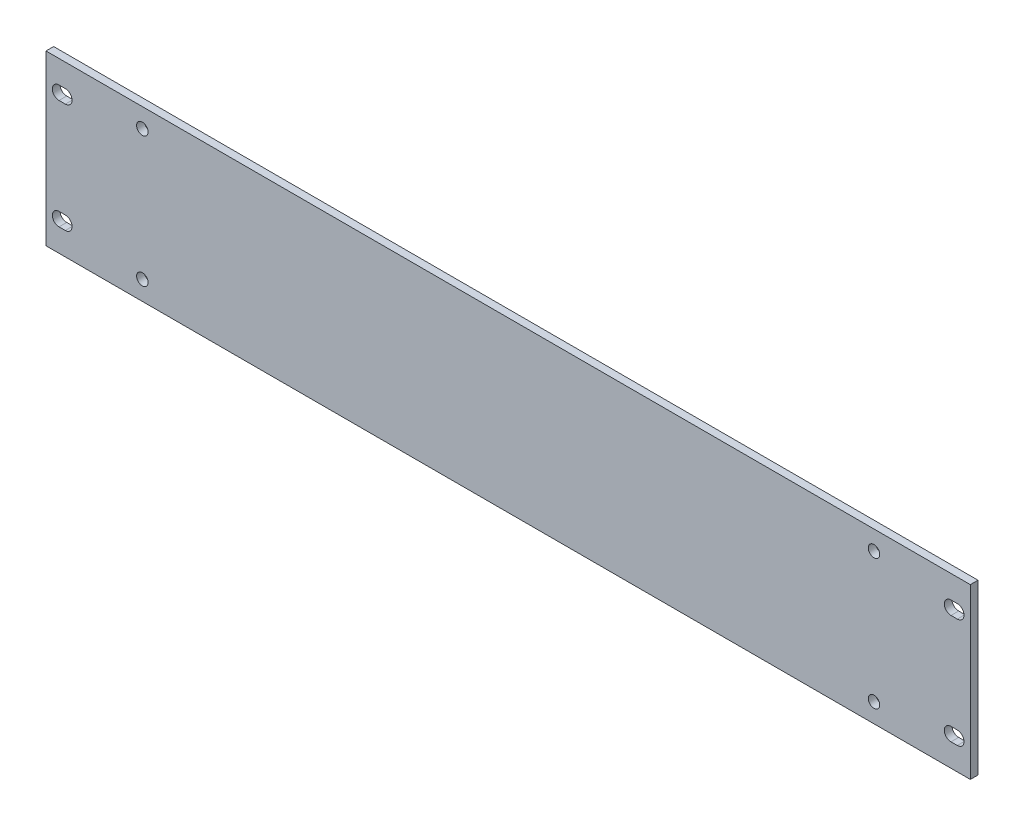
ISO-10303-21;
HEADER;
FILE_DESCRIPTION(('STEP AP214'),'2;1');
FILE_NAME('part.step','',(''),(''),'','','');
FILE_SCHEMA(('AUTOMOTIVE_DESIGN { 1 0 10303 214 1 1 1 1 }'));
ENDSEC;
DATA;
#1=APPLICATION_CONTEXT('core data for automotive mechanical design processes');
#2=APPLICATION_PROTOCOL_DEFINITION('international standard','automotive_design',2000,#1);
#3=PRODUCT_CONTEXT('',#1,'mechanical');
#4=PRODUCT('Part','Part','',(#3));
#5=PRODUCT_RELATED_PRODUCT_CATEGORY('part','',(#4));
#6=PRODUCT_DEFINITION_FORMATION('','',#4);
#7=PRODUCT_DEFINITION_CONTEXT('part definition',#1,'design');
#8=PRODUCT_DEFINITION('design','',#6,#7);
#9=PRODUCT_DEFINITION_SHAPE('','',#8);
#10=(LENGTH_UNIT() NAMED_UNIT(*) SI_UNIT(.MILLI.,.METRE.));
#11=(NAMED_UNIT(*) PLANE_ANGLE_UNIT() SI_UNIT($,.RADIAN.));
#12=(NAMED_UNIT(*) SI_UNIT($,.STERADIAN.) SOLID_ANGLE_UNIT());
#13=UNCERTAINTY_MEASURE_WITH_UNIT(LENGTH_MEASURE(1.E-05),#10,'distance_accuracy_value','');
#14=(GEOMETRIC_REPRESENTATION_CONTEXT(3) GLOBAL_UNCERTAINTY_ASSIGNED_CONTEXT((#13)) GLOBAL_UNIT_ASSIGNED_CONTEXT((#10,
#11,#12)) REPRESENTATION_CONTEXT('',''));
#15=CARTESIAN_POINT('',(0.,0.,0.));
#16=DIRECTION('',(0.,0.,1.));
#17=DIRECTION('',(1.,0.,0.));
#18=AXIS2_PLACEMENT_3D('',#15,#16,#17);
#19=CARTESIAN_POINT('',(0.,0.,4.));
#20=DIRECTION('',(1.,0.,0.));
#21=DIRECTION('',(0.,0.,-1.));
#22=AXIS2_PLACEMENT_3D('',#19,#20,#21);
#23=PLANE('',#22);
#24=DIRECTION('',(0.,-1.,0.));
#25=VECTOR('',#24,1.);
#26=CARTESIAN_POINT('',(0.,0.,0.));
#27=LINE('',#26,#25);
#28=CARTESIAN_POINT('',(0.,88.1,0.));
#29=VERTEX_POINT('',#28);
#30=CARTESIAN_POINT('',(0.,0.,0.));
#31=VERTEX_POINT('',#30);
#32=EDGE_CURVE('E299',#29,#31,#27,.T.);
#33=ORIENTED_EDGE('',*,*,#32,.T.);
#34=DIRECTION('',(0.,0.,-1.));
#35=VECTOR('',#34,1.);
#36=CARTESIAN_POINT('',(0.,0.,4.));
#37=LINE('',#36,#35);
#38=CARTESIAN_POINT('',(0.,0.,4.));
#39=VERTEX_POINT('',#38);
#40=EDGE_CURVE('E11',#39,#31,#37,.T.);
#41=ORIENTED_EDGE('',*,*,#40,.F.);
#42=DIRECTION('',(0.,-1.,0.));
#43=VECTOR('',#42,1.);
#44=CARTESIAN_POINT('',(0.,0.,4.));
#45=LINE('',#44,#43);
#46=CARTESIAN_POINT('',(0.,88.1,4.));
#47=VERTEX_POINT('',#46);
#48=EDGE_CURVE('E306',#47,#39,#45,.T.);
#49=ORIENTED_EDGE('',*,*,#48,.F.);
#50=DIRECTION('',(0.,0.,-1.));
#51=VECTOR('',#50,1.);
#52=CARTESIAN_POINT('',(0.,88.1,4.));
#53=LINE('',#52,#51);
#54=EDGE_CURVE('E316',#47,#29,#53,.T.);
#55=ORIENTED_EDGE('',*,*,#54,.T.);
#56=EDGE_LOOP('',(#33,#41,#49,#55));
#57=FACE_BOUND('',#56,.T.);
#58=ADVANCED_FACE('F33',(#57),#23,.F.);
#59=CARTESIAN_POINT('',(0.,0.,4.));
#60=DIRECTION('',(0.,1.,0.));
#61=DIRECTION('',(0.,0.,1.));
#62=AXIS2_PLACEMENT_3D('',#59,#60,#61);
#63=PLANE('',#62);
#64=DIRECTION('',(1.,0.,0.));
#65=VECTOR('',#64,1.);
#66=CARTESIAN_POINT('',(0.,0.,0.));
#67=LINE('',#66,#65);
#68=CARTESIAN_POINT('',(482.6,0.,0.));
#69=VERTEX_POINT('',#68);
#70=EDGE_CURVE('E319',#31,#69,#67,.T.);
#71=ORIENTED_EDGE('',*,*,#70,.T.);
#72=DIRECTION('',(0.,0.,-1.));
#73=VECTOR('',#72,1.);
#74=CARTESIAN_POINT('',(482.6,0.,4.));
#75=LINE('',#74,#73);
#76=CARTESIAN_POINT('',(482.6,0.,4.));
#77=VERTEX_POINT('',#76);
#78=EDGE_CURVE('E40',#77,#69,#75,.T.);
#79=ORIENTED_EDGE('',*,*,#78,.F.);
#80=DIRECTION('',(1.,0.,0.));
#81=VECTOR('',#80,1.);
#82=CARTESIAN_POINT('',(0.,0.,4.));
#83=LINE('',#82,#81);
#84=EDGE_CURVE('E309',#39,#77,#83,.T.);
#85=ORIENTED_EDGE('',*,*,#84,.F.);
#86=ORIENTED_EDGE('',*,*,#40,.T.);
#87=EDGE_LOOP('',(#71,#79,#85,#86));
#88=FACE_BOUND('',#87,.T.);
#89=ADVANCED_FACE('F348',(#88),#63,.F.);
#90=CARTESIAN_POINT('',(482.6,0.,4.));
#91=DIRECTION('',(-1.,0.,0.));
#92=DIRECTION('',(0.,0.,1.));
#93=AXIS2_PLACEMENT_3D('',#90,#91,#92);
#94=PLANE('',#93);
#95=DIRECTION('',(0.,1.,0.));
#96=VECTOR('',#95,1.);
#97=CARTESIAN_POINT('',(482.6,0.,0.));
#98=LINE('',#97,#96);
#99=CARTESIAN_POINT('',(482.6,88.1,0.));
#100=VERTEX_POINT('',#99);
#101=EDGE_CURVE('E321',#69,#100,#98,.T.);
#102=ORIENTED_EDGE('',*,*,#101,.T.);
#103=DIRECTION('',(0.,0.,-1.));
#104=VECTOR('',#103,1.);
#105=CARTESIAN_POINT('',(482.6,88.1,4.));
#106=LINE('',#105,#104);
#107=CARTESIAN_POINT('',(482.6,88.1,4.));
#108=VERTEX_POINT('',#107);
#109=EDGE_CURVE('E326',#108,#100,#106,.T.);
#110=ORIENTED_EDGE('',*,*,#109,.F.);
#111=DIRECTION('',(0.,1.,0.));
#112=VECTOR('',#111,1.);
#113=CARTESIAN_POINT('',(482.6,0.,4.));
#114=LINE('',#113,#112);
#115=EDGE_CURVE('E312',#77,#108,#114,.T.);
#116=ORIENTED_EDGE('',*,*,#115,.F.);
#117=ORIENTED_EDGE('',*,*,#78,.T.);
#118=EDGE_LOOP('',(#102,#110,#116,#117));
#119=FACE_BOUND('',#118,.T.);
#120=ADVANCED_FACE('F333',(#119),#94,.F.);
#121=CARTESIAN_POINT('',(0.,88.1,4.));
#122=DIRECTION('',(0.,-1.,0.));
#123=DIRECTION('',(0.,0.,-1.));
#124=AXIS2_PLACEMENT_3D('',#121,#122,#123);
#125=PLANE('',#124);
#126=DIRECTION('',(-1.,0.,0.));
#127=VECTOR('',#126,1.);
#128=CARTESIAN_POINT('',(0.,88.1,0.));
#129=LINE('',#128,#127);
#130=EDGE_CURVE('E310',#100,#29,#129,.T.);
#131=ORIENTED_EDGE('',*,*,#130,.T.);
#132=ORIENTED_EDGE('',*,*,#54,.F.);
#133=DIRECTION('',(-1.,0.,0.));
#134=VECTOR('',#133,1.);
#135=CARTESIAN_POINT('',(0.,88.1,4.));
#136=LINE('',#135,#134);
#137=EDGE_CURVE('E314',#108,#47,#136,.T.);
#138=ORIENTED_EDGE('',*,*,#137,.F.);
#139=ORIENTED_EDGE('',*,*,#109,.T.);
#140=EDGE_LOOP('',(#131,#132,#138,#139));
#141=FACE_BOUND('',#140,.T.);
#142=ADVANCED_FACE('F341',(#141),#125,.F.);
#143=CARTESIAN_POINT('',(0.,0.,4.));
#144=DIRECTION('',(0.,0.,-1.));
#145=DIRECTION('',(-1.,0.,0.));
#146=AXIS2_PLACEMENT_3D('',#143,#144,#145);
#147=PLANE('',#146);
#148=CARTESIAN_POINT('',(50.3000000000007,10.,4.));
#149=DIRECTION('',(0.,0.,1.));
#150=DIRECTION('',(1.,0.,0.));
#151=AXIS2_PLACEMENT_3D('',#148,#149,#150);
#152=CIRCLE('',#151,3.00000000000001);
#153=CARTESIAN_POINT('',(53.3000000000007,10.,4.));
#154=VERTEX_POINT('',#153);
#155=EDGE_CURVE('E446',#154,#154,#152,.T.);
#156=ORIENTED_EDGE('',*,*,#155,.F.);
#157=EDGE_LOOP('',(#156));
#158=FACE_BOUND('',#157,.T.);
#159=CARTESIAN_POINT('',(432.300000000001,9.99999999999999,4.));
#160=DIRECTION('',(0.,0.,1.));
#161=DIRECTION('',(1.,0.,0.));
#162=AXIS2_PLACEMENT_3D('',#159,#160,#161);
#163=CIRCLE('',#162,2.99999999999999);
#164=CARTESIAN_POINT('',(435.300000000001,9.99999999999999,4.));
#165=VERTEX_POINT('',#164);
#166=EDGE_CURVE('E448',#165,#165,#163,.T.);
#167=ORIENTED_EDGE('',*,*,#166,.F.);
#168=EDGE_LOOP('',(#167));
#169=FACE_BOUND('',#168,.T.);
#170=CARTESIAN_POINT('',(432.3,78.1,4.));
#171=DIRECTION('',(0.,0.,1.));
#172=DIRECTION('',(1.,0.,0.));
#173=AXIS2_PLACEMENT_3D('',#170,#171,#172);
#174=CIRCLE('',#173,2.99999999999999);
#175=CARTESIAN_POINT('',(435.3,78.1,4.));
#176=VERTEX_POINT('',#175);
#177=EDGE_CURVE('E454',#176,#176,#174,.T.);
#178=ORIENTED_EDGE('',*,*,#177,.F.);
#179=EDGE_LOOP('',(#178));
#180=FACE_BOUND('',#179,.T.);
#181=CARTESIAN_POINT('',(50.3,78.1,4.));
#182=DIRECTION('',(0.,0.,1.));
#183=DIRECTION('',(1.,0.,0.));
#184=AXIS2_PLACEMENT_3D('',#181,#182,#183);
#185=CIRCLE('',#184,3.00000000000001);
#186=CARTESIAN_POINT('',(53.3,78.1,4.));
#187=VERTEX_POINT('',#186);
#188=EDGE_CURVE('E193',#187,#187,#185,.T.);
#189=ORIENTED_EDGE('',*,*,#188,.F.);
#190=EDGE_LOOP('',(#189));
#191=FACE_BOUND('',#190,.T.);
#192=DIRECTION('',(1.,0.,0.));
#193=VECTOR('',#192,1.);
#194=CARTESIAN_POINT('',(6.80000000000057,11.97,4.));
#195=LINE('',#194,#193);
#196=CARTESIAN_POINT('',(6.80000000000057,11.97,4.));
#197=VERTEX_POINT('',#196);
#198=CARTESIAN_POINT('',(10.1000000000006,11.97,4.));
#199=VERTEX_POINT('',#198);
#200=EDGE_CURVE('E199',#197,#199,#195,.T.);
#201=ORIENTED_EDGE('',*,*,#200,.F.);
#202=CARTESIAN_POINT('',(6.80000000000057,15.47,4.));
#203=DIRECTION('',(0.,0.,1.));
#204=DIRECTION('',(1.,0.,0.));
#205=AXIS2_PLACEMENT_3D('',#202,#203,#204);
#206=CIRCLE('',#205,3.5);
#207=CARTESIAN_POINT('',(6.80000000000057,18.97,4.));
#208=VERTEX_POINT('',#207);
#209=EDGE_CURVE('E47',#208,#197,#206,.T.);
#210=ORIENTED_EDGE('',*,*,#209,.F.);
#211=DIRECTION('',(-1.,0.,0.));
#212=VECTOR('',#211,1.);
#213=CARTESIAN_POINT('',(6.80000000000057,18.97,4.));
#214=LINE('',#213,#212);
#215=CARTESIAN_POINT('',(10.1000000000006,18.97,4.));
#216=VERTEX_POINT('',#215);
#217=EDGE_CURVE('E187',#216,#208,#214,.T.);
#218=ORIENTED_EDGE('',*,*,#217,.F.);
#219=CARTESIAN_POINT('',(10.1000000000006,15.47,4.));
#220=DIRECTION('',(0.,0.,1.));
#221=DIRECTION('',(1.,0.,0.));
#222=AXIS2_PLACEMENT_3D('',#219,#220,#221);
#223=CIRCLE('',#222,3.5);
#224=EDGE_CURVE('E190',#199,#216,#223,.T.);
#225=ORIENTED_EDGE('',*,*,#224,.F.);
#226=EDGE_LOOP('',(#201,#210,#218,#225));
#227=FACE_BOUND('',#226,.T.);
#228=DIRECTION('',(1.,0.,0.));
#229=VECTOR('',#228,1.);
#230=CARTESIAN_POINT('',(472.500000000001,11.97,4.));
#231=LINE('',#230,#229);
#232=CARTESIAN_POINT('',(472.500000000001,11.97,4.));
#233=VERTEX_POINT('',#232);
#234=CARTESIAN_POINT('',(475.800000000001,11.97,4.));
#235=VERTEX_POINT('',#234);
#236=EDGE_CURVE('E225',#233,#235,#231,.T.);
#237=ORIENTED_EDGE('',*,*,#236,.F.);
#238=CARTESIAN_POINT('',(472.500000000001,15.47,4.));
#239=DIRECTION('',(0.,0.,1.));
#240=DIRECTION('',(1.,0.,0.));
#241=AXIS2_PLACEMENT_3D('',#238,#239,#240);
#242=CIRCLE('',#241,3.5);
#243=CARTESIAN_POINT('',(472.500000000001,18.97,4.));
#244=VERTEX_POINT('',#243);
#245=EDGE_CURVE('E206',#244,#233,#242,.T.);
#246=ORIENTED_EDGE('',*,*,#245,.F.);
#247=DIRECTION('',(-1.,0.,0.));
#248=VECTOR('',#247,1.);
#249=CARTESIAN_POINT('',(472.500000000001,18.97,4.));
#250=LINE('',#249,#248);
#251=CARTESIAN_POINT('',(475.800000000001,18.97,4.));
#252=VERTEX_POINT('',#251);
#253=EDGE_CURVE('E214',#252,#244,#250,.T.);
#254=ORIENTED_EDGE('',*,*,#253,.F.);
#255=CARTESIAN_POINT('',(475.800000000001,15.47,4.));
#256=DIRECTION('',(0.,0.,1.));
#257=DIRECTION('',(1.,0.,0.));
#258=AXIS2_PLACEMENT_3D('',#255,#256,#257);
#259=CIRCLE('',#258,3.5);
#260=EDGE_CURVE('E228',#235,#252,#259,.T.);
#261=ORIENTED_EDGE('',*,*,#260,.F.);
#262=EDGE_LOOP('',(#237,#246,#254,#261));
#263=FACE_BOUND('',#262,.T.);
#264=DIRECTION('',(1.,0.,0.));
#265=VECTOR('',#264,1.);
#266=CARTESIAN_POINT('',(472.5,69.12,4.));
#267=LINE('',#266,#265);
#268=CARTESIAN_POINT('',(472.5,69.12,4.));
#269=VERTEX_POINT('',#268);
#270=CARTESIAN_POINT('',(475.8,69.12,4.));
#271=VERTEX_POINT('',#270);
#272=EDGE_CURVE('E257',#269,#271,#267,.T.);
#273=ORIENTED_EDGE('',*,*,#272,.F.);
#274=CARTESIAN_POINT('',(472.5,72.62,4.));
#275=DIRECTION('',(0.,0.,1.));
#276=DIRECTION('',(1.,0.,0.));
#277=AXIS2_PLACEMENT_3D('',#274,#275,#276);
#278=CIRCLE('',#277,3.5);
#279=CARTESIAN_POINT('',(472.5,76.12,4.));
#280=VERTEX_POINT('',#279);
#281=EDGE_CURVE('E235',#280,#269,#278,.T.);
#282=ORIENTED_EDGE('',*,*,#281,.F.);
#283=DIRECTION('',(-1.,0.,0.));
#284=VECTOR('',#283,1.);
#285=CARTESIAN_POINT('',(472.5,76.12,4.));
#286=LINE('',#285,#284);
#287=CARTESIAN_POINT('',(475.8,76.12,4.));
#288=VERTEX_POINT('',#287);
#289=EDGE_CURVE('E246',#288,#280,#286,.T.);
#290=ORIENTED_EDGE('',*,*,#289,.F.);
#291=CARTESIAN_POINT('',(475.8,72.62,4.));
#292=DIRECTION('',(0.,0.,1.));
#293=DIRECTION('',(1.,0.,0.));
#294=AXIS2_PLACEMENT_3D('',#291,#292,#293);
#295=CIRCLE('',#294,3.5);
#296=EDGE_CURVE('E260',#271,#288,#295,.T.);
#297=ORIENTED_EDGE('',*,*,#296,.F.);
#298=EDGE_LOOP('',(#273,#282,#290,#297));
#299=FACE_BOUND('',#298,.T.);
#300=DIRECTION('',(1.,0.,0.));
#301=VECTOR('',#300,1.);
#302=CARTESIAN_POINT('',(6.8,69.12,4.));
#303=LINE('',#302,#301);
#304=CARTESIAN_POINT('',(6.8,69.12,4.));
#305=VERTEX_POINT('',#304);
#306=CARTESIAN_POINT('',(10.1,69.12,4.));
#307=VERTEX_POINT('',#306);
#308=EDGE_CURVE('E289',#305,#307,#303,.T.);
#309=ORIENTED_EDGE('',*,*,#308,.F.);
#310=CARTESIAN_POINT('',(6.79999999999997,72.62,4.));
#311=DIRECTION('',(0.,0.,1.));
#312=DIRECTION('',(1.,0.,0.));
#313=AXIS2_PLACEMENT_3D('',#310,#311,#312);
#314=CIRCLE('',#313,3.5);
#315=CARTESIAN_POINT('',(6.8,76.12,4.));
#316=VERTEX_POINT('',#315);
#317=EDGE_CURVE('E267',#316,#305,#314,.T.);
#318=ORIENTED_EDGE('',*,*,#317,.F.);
#319=DIRECTION('',(-1.,0.,0.));
#320=VECTOR('',#319,1.);
#321=CARTESIAN_POINT('',(6.8,76.12,4.));
#322=LINE('',#321,#320);
#323=CARTESIAN_POINT('',(10.1,76.12,4.));
#324=VERTEX_POINT('',#323);
#325=EDGE_CURVE('E278',#324,#316,#322,.T.);
#326=ORIENTED_EDGE('',*,*,#325,.F.);
#327=CARTESIAN_POINT('',(10.1,72.62,4.));
#328=DIRECTION('',(0.,0.,1.));
#329=DIRECTION('',(1.,0.,0.));
#330=AXIS2_PLACEMENT_3D('',#327,#328,#329);
#331=CIRCLE('',#330,3.5);
#332=EDGE_CURVE('E292',#307,#324,#331,.T.);
#333=ORIENTED_EDGE('',*,*,#332,.F.);
#334=EDGE_LOOP('',(#309,#318,#326,#333));
#335=FACE_BOUND('',#334,.T.);
#336=ORIENTED_EDGE('',*,*,#48,.T.);
#337=ORIENTED_EDGE('',*,*,#84,.T.);
#338=ORIENTED_EDGE('',*,*,#115,.T.);
#339=ORIENTED_EDGE('',*,*,#137,.T.);
#340=EDGE_LOOP('',(#336,#337,#338,#339));
#341=FACE_BOUND('',#340,.T.);
#342=ADVANCED_FACE('F347',(#158,#169,#180,#191,#227,#263,#299,#335,#341),#147,.F.);
#343=CARTESIAN_POINT('',(0.,0.,0.));
#344=DIRECTION('',(0.,0.,-1.));
#345=DIRECTION('',(-1.,0.,0.));
#346=AXIS2_PLACEMENT_3D('',#343,#344,#345);
#347=PLANE('',#346);
#348=CARTESIAN_POINT('',(50.3000000000007,10.,0.));
#349=DIRECTION('',(0.,0.,1.));
#350=DIRECTION('',(1.,0.,0.));
#351=AXIS2_PLACEMENT_3D('',#348,#349,#350);
#352=CIRCLE('',#351,3.00000000000001);
#353=CARTESIAN_POINT('',(53.3000000000007,10.,0.));
#354=VERTEX_POINT('',#353);
#355=EDGE_CURVE('E443',#354,#354,#352,.T.);
#356=ORIENTED_EDGE('',*,*,#355,.T.);
#357=EDGE_LOOP('',(#356));
#358=FACE_BOUND('',#357,.T.);
#359=CARTESIAN_POINT('',(432.300000000001,9.99999999999999,0.));
#360=DIRECTION('',(0.,0.,1.));
#361=DIRECTION('',(1.,0.,0.));
#362=AXIS2_PLACEMENT_3D('',#359,#360,#361);
#363=CIRCLE('',#362,2.99999999999999);
#364=CARTESIAN_POINT('',(435.300000000001,9.99999999999999,0.));
#365=VERTEX_POINT('',#364);
#366=EDGE_CURVE('E451',#365,#365,#363,.T.);
#367=ORIENTED_EDGE('',*,*,#366,.T.);
#368=EDGE_LOOP('',(#367));
#369=FACE_BOUND('',#368,.T.);
#370=CARTESIAN_POINT('',(432.3,78.1,0.));
#371=DIRECTION('',(0.,0.,1.));
#372=DIRECTION('',(1.,0.,0.));
#373=AXIS2_PLACEMENT_3D('',#370,#371,#372);
#374=CIRCLE('',#373,2.99999999999999);
#375=CARTESIAN_POINT('',(435.3,78.1,0.));
#376=VERTEX_POINT('',#375);
#377=EDGE_CURVE('E457',#376,#376,#374,.T.);
#378=ORIENTED_EDGE('',*,*,#377,.T.);
#379=EDGE_LOOP('',(#378));
#380=FACE_BOUND('',#379,.T.);
#381=CARTESIAN_POINT('',(50.3,78.1,0.));
#382=DIRECTION('',(0.,0.,1.));
#383=DIRECTION('',(1.,0.,0.));
#384=AXIS2_PLACEMENT_3D('',#381,#382,#383);
#385=CIRCLE('',#384,3.00000000000001);
#386=CARTESIAN_POINT('',(53.3,78.1,0.));
#387=VERTEX_POINT('',#386);
#388=EDGE_CURVE('E200',#387,#387,#385,.T.);
#389=ORIENTED_EDGE('',*,*,#388,.T.);
#390=EDGE_LOOP('',(#389));
#391=FACE_BOUND('',#390,.T.);
#392=CARTESIAN_POINT('',(6.80000000000057,15.47,0.));
#393=DIRECTION('',(0.,0.,1.));
#394=DIRECTION('',(1.,0.,0.));
#395=AXIS2_PLACEMENT_3D('',#392,#393,#394);
#396=CIRCLE('',#395,3.5);
#397=CARTESIAN_POINT('',(6.80000000000057,18.97,0.));
#398=VERTEX_POINT('',#397);
#399=CARTESIAN_POINT('',(6.80000000000057,11.97,0.));
#400=VERTEX_POINT('',#399);
#401=EDGE_CURVE('E171',#398,#400,#396,.T.);
#402=ORIENTED_EDGE('',*,*,#401,.T.);
#403=DIRECTION('',(1.,0.,0.));
#404=VECTOR('',#403,1.);
#405=CARTESIAN_POINT('',(6.80000000000057,11.97,0.));
#406=LINE('',#405,#404);
#407=CARTESIAN_POINT('',(10.1000000000006,11.97,0.));
#408=VERTEX_POINT('',#407);
#409=EDGE_CURVE('E180',#400,#408,#406,.T.);
#410=ORIENTED_EDGE('',*,*,#409,.T.);
#411=CARTESIAN_POINT('',(10.1000000000006,15.47,0.));
#412=DIRECTION('',(0.,0.,1.));
#413=DIRECTION('',(1.,0.,0.));
#414=AXIS2_PLACEMENT_3D('',#411,#412,#413);
#415=CIRCLE('',#414,3.5);
#416=CARTESIAN_POINT('',(10.1000000000006,18.97,0.));
#417=VERTEX_POINT('',#416);
#418=EDGE_CURVE('E55',#408,#417,#415,.T.);
#419=ORIENTED_EDGE('',*,*,#418,.T.);
#420=DIRECTION('',(-1.,0.,0.));
#421=VECTOR('',#420,1.);
#422=CARTESIAN_POINT('',(6.80000000000057,18.97,0.));
#423=LINE('',#422,#421);
#424=EDGE_CURVE('E177',#417,#398,#423,.T.);
#425=ORIENTED_EDGE('',*,*,#424,.T.);
#426=EDGE_LOOP('',(#402,#410,#419,#425));
#427=FACE_BOUND('',#426,.T.);
#428=CARTESIAN_POINT('',(472.500000000001,15.47,0.));
#429=DIRECTION('',(0.,0.,1.));
#430=DIRECTION('',(1.,0.,0.));
#431=AXIS2_PLACEMENT_3D('',#428,#429,#430);
#432=CIRCLE('',#431,3.5);
#433=CARTESIAN_POINT('',(472.500000000001,18.97,0.));
#434=VERTEX_POINT('',#433);
#435=CARTESIAN_POINT('',(472.500000000001,11.97,0.));
#436=VERTEX_POINT('',#435);
#437=EDGE_CURVE('E210',#434,#436,#432,.T.);
#438=ORIENTED_EDGE('',*,*,#437,.T.);
#439=DIRECTION('',(1.,0.,0.));
#440=VECTOR('',#439,1.);
#441=CARTESIAN_POINT('',(472.500000000001,11.97,0.));
#442=LINE('',#441,#440);
#443=CARTESIAN_POINT('',(475.800000000001,11.97,0.));
#444=VERTEX_POINT('',#443);
#445=EDGE_CURVE('E213',#436,#444,#442,.T.);
#446=ORIENTED_EDGE('',*,*,#445,.T.);
#447=CARTESIAN_POINT('',(475.800000000001,15.47,0.));
#448=DIRECTION('',(0.,0.,1.));
#449=DIRECTION('',(1.,0.,0.));
#450=AXIS2_PLACEMENT_3D('',#447,#448,#449);
#451=CIRCLE('',#450,3.5);
#452=CARTESIAN_POINT('',(475.800000000001,18.97,0.));
#453=VERTEX_POINT('',#452);
#454=EDGE_CURVE('E217',#444,#453,#451,.T.);
#455=ORIENTED_EDGE('',*,*,#454,.T.);
#456=DIRECTION('',(-1.,0.,0.));
#457=VECTOR('',#456,1.);
#458=CARTESIAN_POINT('',(472.500000000001,18.97,0.));
#459=LINE('',#458,#457);
#460=EDGE_CURVE('E220',#453,#434,#459,.T.);
#461=ORIENTED_EDGE('',*,*,#460,.T.);
#462=EDGE_LOOP('',(#438,#446,#455,#461));
#463=FACE_BOUND('',#462,.T.);
#464=CARTESIAN_POINT('',(472.5,72.62,0.));
#465=DIRECTION('',(0.,0.,1.));
#466=DIRECTION('',(1.,0.,0.));
#467=AXIS2_PLACEMENT_3D('',#464,#465,#466);
#468=CIRCLE('',#467,3.5);
#469=CARTESIAN_POINT('',(472.5,76.12,0.));
#470=VERTEX_POINT('',#469);
#471=CARTESIAN_POINT('',(472.5,69.12,0.));
#472=VERTEX_POINT('',#471);
#473=EDGE_CURVE('E242',#470,#472,#468,.T.);
#474=ORIENTED_EDGE('',*,*,#473,.T.);
#475=DIRECTION('',(1.,0.,0.));
#476=VECTOR('',#475,1.);
#477=CARTESIAN_POINT('',(472.5,69.12,0.));
#478=LINE('',#477,#476);
#479=CARTESIAN_POINT('',(475.8,69.12,0.));
#480=VERTEX_POINT('',#479);
#481=EDGE_CURVE('E245',#472,#480,#478,.T.);
#482=ORIENTED_EDGE('',*,*,#481,.T.);
#483=CARTESIAN_POINT('',(475.8,72.62,0.));
#484=DIRECTION('',(0.,0.,1.));
#485=DIRECTION('',(1.,0.,0.));
#486=AXIS2_PLACEMENT_3D('',#483,#484,#485);
#487=CIRCLE('',#486,3.5);
#488=CARTESIAN_POINT('',(475.8,76.12,0.));
#489=VERTEX_POINT('',#488);
#490=EDGE_CURVE('E249',#480,#489,#487,.T.);
#491=ORIENTED_EDGE('',*,*,#490,.T.);
#492=DIRECTION('',(-1.,0.,0.));
#493=VECTOR('',#492,1.);
#494=CARTESIAN_POINT('',(472.5,76.12,0.));
#495=LINE('',#494,#493);
#496=EDGE_CURVE('E252',#489,#470,#495,.T.);
#497=ORIENTED_EDGE('',*,*,#496,.T.);
#498=EDGE_LOOP('',(#474,#482,#491,#497));
#499=FACE_BOUND('',#498,.T.);
#500=CARTESIAN_POINT('',(6.79999999999997,72.62,0.));
#501=DIRECTION('',(0.,0.,1.));
#502=DIRECTION('',(1.,0.,0.));
#503=AXIS2_PLACEMENT_3D('',#500,#501,#502);
#504=CIRCLE('',#503,3.5);
#505=CARTESIAN_POINT('',(6.8,76.12,0.));
#506=VERTEX_POINT('',#505);
#507=CARTESIAN_POINT('',(6.8,69.12,0.));
#508=VERTEX_POINT('',#507);
#509=EDGE_CURVE('E274',#506,#508,#504,.T.);
#510=ORIENTED_EDGE('',*,*,#509,.T.);
#511=DIRECTION('',(1.,0.,0.));
#512=VECTOR('',#511,1.);
#513=CARTESIAN_POINT('',(6.8,69.12,0.));
#514=LINE('',#513,#512);
#515=CARTESIAN_POINT('',(10.1,69.12,0.));
#516=VERTEX_POINT('',#515);
#517=EDGE_CURVE('E277',#508,#516,#514,.T.);
#518=ORIENTED_EDGE('',*,*,#517,.T.);
#519=CARTESIAN_POINT('',(10.1,72.62,0.));
#520=DIRECTION('',(0.,0.,1.));
#521=DIRECTION('',(1.,0.,0.));
#522=AXIS2_PLACEMENT_3D('',#519,#520,#521);
#523=CIRCLE('',#522,3.5);
#524=CARTESIAN_POINT('',(10.1,76.12,0.));
#525=VERTEX_POINT('',#524);
#526=EDGE_CURVE('E281',#516,#525,#523,.T.);
#527=ORIENTED_EDGE('',*,*,#526,.T.);
#528=DIRECTION('',(-1.,0.,0.));
#529=VECTOR('',#528,1.);
#530=CARTESIAN_POINT('',(6.8,76.12,0.));
#531=LINE('',#530,#529);
#532=EDGE_CURVE('E284',#525,#506,#531,.T.);
#533=ORIENTED_EDGE('',*,*,#532,.T.);
#534=EDGE_LOOP('',(#510,#518,#527,#533));
#535=FACE_BOUND('',#534,.T.);
#536=ORIENTED_EDGE('',*,*,#32,.F.);
#537=ORIENTED_EDGE('',*,*,#130,.F.);
#538=ORIENTED_EDGE('',*,*,#101,.F.);
#539=ORIENTED_EDGE('',*,*,#70,.F.);
#540=EDGE_LOOP('',(#536,#537,#538,#539));
#541=FACE_BOUND('',#540,.T.);
#542=ADVANCED_FACE('F184',(#358,#369,#380,#391,#427,#463,#499,#535,#541),#347,.T.);
#543=CARTESIAN_POINT('',(6.79999999999997,72.62,0.));
#544=DIRECTION('',(0.,0.,1.));
#545=DIRECTION('',(1.,0.,0.));
#546=AXIS2_PLACEMENT_3D('',#543,#544,#545);
#547=CYLINDRICAL_SURFACE('',#546,3.5);
#548=ORIENTED_EDGE('',*,*,#317,.T.);
#549=DIRECTION('',(0.,0.,1.));
#550=VECTOR('',#549,1.);
#551=CARTESIAN_POINT('',(6.8,69.12,0.));
#552=LINE('',#551,#550);
#553=EDGE_CURVE('E287',#508,#305,#552,.T.);
#554=ORIENTED_EDGE('',*,*,#553,.F.);
#555=ORIENTED_EDGE('',*,*,#509,.F.);
#556=DIRECTION('',(0.,0.,1.));
#557=VECTOR('',#556,1.);
#558=CARTESIAN_POINT('',(6.8,76.12,0.));
#559=LINE('',#558,#557);
#560=EDGE_CURVE('E297',#506,#316,#559,.T.);
#561=ORIENTED_EDGE('',*,*,#560,.T.);
#562=EDGE_LOOP('',(#548,#554,#555,#561));
#563=FACE_BOUND('',#562,.T.);
#564=ADVANCED_FACE('F360',(#563),#547,.F.);
#565=CARTESIAN_POINT('',(6.8,76.12,0.));
#566=DIRECTION('',(0.,1.,0.));
#567=DIRECTION('',(0.,0.,1.));
#568=AXIS2_PLACEMENT_3D('',#565,#566,#567);
#569=PLANE('',#568);
#570=ORIENTED_EDGE('',*,*,#325,.T.);
#571=ORIENTED_EDGE('',*,*,#560,.F.);
#572=ORIENTED_EDGE('',*,*,#532,.F.);
#573=DIRECTION('',(0.,0.,1.));
#574=VECTOR('',#573,1.);
#575=CARTESIAN_POINT('',(10.1,76.12,0.));
#576=LINE('',#575,#574);
#577=EDGE_CURVE('E300',#525,#324,#576,.T.);
#578=ORIENTED_EDGE('',*,*,#577,.T.);
#579=EDGE_LOOP('',(#570,#571,#572,#578));
#580=FACE_BOUND('',#579,.T.);
#581=ADVANCED_FACE('F367',(#580),#569,.F.);
#582=CARTESIAN_POINT('',(10.1,72.62,0.));
#583=DIRECTION('',(0.,0.,1.));
#584=DIRECTION('',(1.,0.,0.));
#585=AXIS2_PLACEMENT_3D('',#582,#583,#584);
#586=CYLINDRICAL_SURFACE('',#585,3.5);
#587=ORIENTED_EDGE('',*,*,#332,.T.);
#588=ORIENTED_EDGE('',*,*,#577,.F.);
#589=ORIENTED_EDGE('',*,*,#526,.F.);
#590=DIRECTION('',(0.,0.,1.));
#591=VECTOR('',#590,1.);
#592=CARTESIAN_POINT('',(10.1,69.12,0.));
#593=LINE('',#592,#591);
#594=EDGE_CURVE('E302',#516,#307,#593,.T.);
#595=ORIENTED_EDGE('',*,*,#594,.T.);
#596=EDGE_LOOP('',(#587,#588,#589,#595));
#597=FACE_BOUND('',#596,.T.);
#598=ADVANCED_FACE('F373',(#597),#586,.F.);
#599=CARTESIAN_POINT('',(6.8,69.12,0.));
#600=DIRECTION('',(0.,-1.,0.));
#601=DIRECTION('',(0.,0.,-1.));
#602=AXIS2_PLACEMENT_3D('',#599,#600,#601);
#603=PLANE('',#602);
#604=ORIENTED_EDGE('',*,*,#308,.T.);
#605=ORIENTED_EDGE('',*,*,#594,.F.);
#606=ORIENTED_EDGE('',*,*,#517,.F.);
#607=ORIENTED_EDGE('',*,*,#553,.T.);
#608=EDGE_LOOP('',(#604,#605,#606,#607));
#609=FACE_BOUND('',#608,.T.);
#610=ADVANCED_FACE('F369',(#609),#603,.F.);
#611=CARTESIAN_POINT('',(472.5,72.62,0.));
#612=DIRECTION('',(0.,0.,1.));
#613=DIRECTION('',(1.,0.,0.));
#614=AXIS2_PLACEMENT_3D('',#611,#612,#613);
#615=CYLINDRICAL_SURFACE('',#614,3.5);
#616=ORIENTED_EDGE('',*,*,#281,.T.);
#617=DIRECTION('',(0.,0.,1.));
#618=VECTOR('',#617,1.);
#619=CARTESIAN_POINT('',(472.5,69.12,0.));
#620=LINE('',#619,#618);
#621=EDGE_CURVE('E255',#472,#269,#620,.T.);
#622=ORIENTED_EDGE('',*,*,#621,.F.);
#623=ORIENTED_EDGE('',*,*,#473,.F.);
#624=DIRECTION('',(0.,0.,1.));
#625=VECTOR('',#624,1.);
#626=CARTESIAN_POINT('',(472.5,76.12,0.));
#627=LINE('',#626,#625);
#628=EDGE_CURVE('E265',#470,#280,#627,.T.);
#629=ORIENTED_EDGE('',*,*,#628,.T.);
#630=EDGE_LOOP('',(#616,#622,#623,#629));
#631=FACE_BOUND('',#630,.T.);
#632=ADVANCED_FACE('F372',(#631),#615,.F.);
#633=CARTESIAN_POINT('',(472.5,76.12,0.));
#634=DIRECTION('',(0.,1.,0.));
#635=DIRECTION('',(0.,0.,1.));
#636=AXIS2_PLACEMENT_3D('',#633,#634,#635);
#637=PLANE('',#636);
#638=ORIENTED_EDGE('',*,*,#289,.T.);
#639=ORIENTED_EDGE('',*,*,#628,.F.);
#640=ORIENTED_EDGE('',*,*,#496,.F.);
#641=DIRECTION('',(0.,0.,1.));
#642=VECTOR('',#641,1.);
#643=CARTESIAN_POINT('',(475.8,76.12,0.));
#644=LINE('',#643,#642);
#645=EDGE_CURVE('E268',#489,#288,#644,.T.);
#646=ORIENTED_EDGE('',*,*,#645,.T.);
#647=EDGE_LOOP('',(#638,#639,#640,#646));
#648=FACE_BOUND('',#647,.T.);
#649=ADVANCED_FACE('F383',(#648),#637,.F.);
#650=CARTESIAN_POINT('',(475.8,72.62,0.));
#651=DIRECTION('',(0.,0.,1.));
#652=DIRECTION('',(1.,0.,0.));
#653=AXIS2_PLACEMENT_3D('',#650,#651,#652);
#654=CYLINDRICAL_SURFACE('',#653,3.5);
#655=ORIENTED_EDGE('',*,*,#296,.T.);
#656=ORIENTED_EDGE('',*,*,#645,.F.);
#657=ORIENTED_EDGE('',*,*,#490,.F.);
#658=DIRECTION('',(0.,0.,1.));
#659=VECTOR('',#658,1.);
#660=CARTESIAN_POINT('',(475.8,69.12,0.));
#661=LINE('',#660,#659);
#662=EDGE_CURVE('E270',#480,#271,#661,.T.);
#663=ORIENTED_EDGE('',*,*,#662,.T.);
#664=EDGE_LOOP('',(#655,#656,#657,#663));
#665=FACE_BOUND('',#664,.T.);
#666=ADVANCED_FACE('F389',(#665),#654,.F.);
#667=CARTESIAN_POINT('',(472.5,69.12,0.));
#668=DIRECTION('',(0.,-1.,0.));
#669=DIRECTION('',(0.,0.,-1.));
#670=AXIS2_PLACEMENT_3D('',#667,#668,#669);
#671=PLANE('',#670);
#672=ORIENTED_EDGE('',*,*,#272,.T.);
#673=ORIENTED_EDGE('',*,*,#662,.F.);
#674=ORIENTED_EDGE('',*,*,#481,.F.);
#675=ORIENTED_EDGE('',*,*,#621,.T.);
#676=EDGE_LOOP('',(#672,#673,#674,#675));
#677=FACE_BOUND('',#676,.T.);
#678=ADVANCED_FACE('F385',(#677),#671,.F.);
#679=CARTESIAN_POINT('',(472.500000000001,15.47,0.));
#680=DIRECTION('',(0.,0.,1.));
#681=DIRECTION('',(1.,0.,0.));
#682=AXIS2_PLACEMENT_3D('',#679,#680,#681);
#683=CYLINDRICAL_SURFACE('',#682,3.5);
#684=ORIENTED_EDGE('',*,*,#245,.T.);
#685=DIRECTION('',(0.,0.,1.));
#686=VECTOR('',#685,1.);
#687=CARTESIAN_POINT('',(472.500000000001,11.97,0.));
#688=LINE('',#687,#686);
#689=EDGE_CURVE('E223',#436,#233,#688,.T.);
#690=ORIENTED_EDGE('',*,*,#689,.F.);
#691=ORIENTED_EDGE('',*,*,#437,.F.);
#692=DIRECTION('',(0.,0.,1.));
#693=VECTOR('',#692,1.);
#694=CARTESIAN_POINT('',(472.500000000001,18.97,0.));
#695=LINE('',#694,#693);
#696=EDGE_CURVE('E233',#434,#244,#695,.T.);
#697=ORIENTED_EDGE('',*,*,#696,.T.);
#698=EDGE_LOOP('',(#684,#690,#691,#697));
#699=FACE_BOUND('',#698,.T.);
#700=ADVANCED_FACE('F388',(#699),#683,.F.);
#701=CARTESIAN_POINT('',(472.500000000001,18.97,0.));
#702=DIRECTION('',(0.,1.,0.));
#703=DIRECTION('',(0.,0.,1.));
#704=AXIS2_PLACEMENT_3D('',#701,#702,#703);
#705=PLANE('',#704);
#706=ORIENTED_EDGE('',*,*,#253,.T.);
#707=ORIENTED_EDGE('',*,*,#696,.F.);
#708=ORIENTED_EDGE('',*,*,#460,.F.);
#709=DIRECTION('',(0.,0.,1.));
#710=VECTOR('',#709,1.);
#711=CARTESIAN_POINT('',(475.800000000001,18.97,0.));
#712=LINE('',#711,#710);
#713=EDGE_CURVE('E236',#453,#252,#712,.T.);
#714=ORIENTED_EDGE('',*,*,#713,.T.);
#715=EDGE_LOOP('',(#706,#707,#708,#714));
#716=FACE_BOUND('',#715,.T.);
#717=ADVANCED_FACE('F399',(#716),#705,.F.);
#718=CARTESIAN_POINT('',(475.800000000001,15.47,0.));
#719=DIRECTION('',(0.,0.,1.));
#720=DIRECTION('',(1.,0.,0.));
#721=AXIS2_PLACEMENT_3D('',#718,#719,#720);
#722=CYLINDRICAL_SURFACE('',#721,3.5);
#723=ORIENTED_EDGE('',*,*,#260,.T.);
#724=ORIENTED_EDGE('',*,*,#713,.F.);
#725=ORIENTED_EDGE('',*,*,#454,.F.);
#726=DIRECTION('',(0.,0.,1.));
#727=VECTOR('',#726,1.);
#728=CARTESIAN_POINT('',(475.800000000001,11.97,0.));
#729=LINE('',#728,#727);
#730=EDGE_CURVE('E238',#444,#235,#729,.T.);
#731=ORIENTED_EDGE('',*,*,#730,.T.);
#732=EDGE_LOOP('',(#723,#724,#725,#731));
#733=FACE_BOUND('',#732,.T.);
#734=ADVANCED_FACE('F404',(#733),#722,.F.);
#735=CARTESIAN_POINT('',(472.500000000001,11.97,0.));
#736=DIRECTION('',(0.,-1.,0.));
#737=DIRECTION('',(0.,0.,-1.));
#738=AXIS2_PLACEMENT_3D('',#735,#736,#737);
#739=PLANE('',#738);
#740=ORIENTED_EDGE('',*,*,#236,.T.);
#741=ORIENTED_EDGE('',*,*,#730,.F.);
#742=ORIENTED_EDGE('',*,*,#445,.F.);
#743=ORIENTED_EDGE('',*,*,#689,.T.);
#744=EDGE_LOOP('',(#740,#741,#742,#743));
#745=FACE_BOUND('',#744,.T.);
#746=ADVANCED_FACE('F401',(#745),#739,.F.);
#747=CARTESIAN_POINT('',(6.80000000000057,15.47,0.));
#748=DIRECTION('',(0.,0.,1.));
#749=DIRECTION('',(1.,0.,0.));
#750=AXIS2_PLACEMENT_3D('',#747,#748,#749);
#751=CYLINDRICAL_SURFACE('',#750,3.5);
#752=ORIENTED_EDGE('',*,*,#209,.T.);
#753=DIRECTION('',(0.,0.,1.));
#754=VECTOR('',#753,1.);
#755=CARTESIAN_POINT('',(6.80000000000057,11.97,0.));
#756=LINE('',#755,#754);
#757=EDGE_CURVE('E167',#400,#197,#756,.T.);
#758=ORIENTED_EDGE('',*,*,#757,.F.);
#759=ORIENTED_EDGE('',*,*,#401,.F.);
#760=DIRECTION('',(0.,0.,1.));
#761=VECTOR('',#760,1.);
#762=CARTESIAN_POINT('',(6.80000000000057,18.97,0.));
#763=LINE('',#762,#761);
#764=EDGE_CURVE('E204',#398,#208,#763,.T.);
#765=ORIENTED_EDGE('',*,*,#764,.T.);
#766=EDGE_LOOP('',(#752,#758,#759,#765));
#767=FACE_BOUND('',#766,.T.);
#768=ADVANCED_FACE('F169',(#767),#751,.F.);
#769=CARTESIAN_POINT('',(6.80000000000057,18.97,0.));
#770=DIRECTION('',(0.,1.,0.));
#771=DIRECTION('',(0.,0.,1.));
#772=AXIS2_PLACEMENT_3D('',#769,#770,#771);
#773=PLANE('',#772);
#774=ORIENTED_EDGE('',*,*,#217,.T.);
#775=ORIENTED_EDGE('',*,*,#764,.F.);
#776=ORIENTED_EDGE('',*,*,#424,.F.);
#777=DIRECTION('',(0.,0.,1.));
#778=VECTOR('',#777,1.);
#779=CARTESIAN_POINT('',(10.1000000000006,18.97,0.));
#780=LINE('',#779,#778);
#781=EDGE_CURVE('E207',#417,#216,#780,.T.);
#782=ORIENTED_EDGE('',*,*,#781,.T.);
#783=EDGE_LOOP('',(#774,#775,#776,#782));
#784=FACE_BOUND('',#783,.T.);
#785=ADVANCED_FACE('F414',(#784),#773,.F.);
#786=CARTESIAN_POINT('',(10.1000000000006,15.47,0.));
#787=DIRECTION('',(0.,0.,1.));
#788=DIRECTION('',(1.,0.,0.));
#789=AXIS2_PLACEMENT_3D('',#786,#787,#788);
#790=CYLINDRICAL_SURFACE('',#789,3.5);
#791=ORIENTED_EDGE('',*,*,#224,.T.);
#792=ORIENTED_EDGE('',*,*,#781,.F.);
#793=ORIENTED_EDGE('',*,*,#418,.F.);
#794=DIRECTION('',(0.,0.,1.));
#795=VECTOR('',#794,1.);
#796=CARTESIAN_POINT('',(10.1000000000006,11.97,0.));
#797=LINE('',#796,#795);
#798=EDGE_CURVE('E176',#408,#199,#797,.T.);
#799=ORIENTED_EDGE('',*,*,#798,.T.);
#800=EDGE_LOOP('',(#791,#792,#793,#799));
#801=FACE_BOUND('',#800,.T.);
#802=ADVANCED_FACE('F418',(#801),#790,.F.);
#803=CARTESIAN_POINT('',(6.80000000000057,11.97,0.));
#804=DIRECTION('',(0.,-1.,0.));
#805=DIRECTION('',(0.,0.,-1.));
#806=AXIS2_PLACEMENT_3D('',#803,#804,#805);
#807=PLANE('',#806);
#808=ORIENTED_EDGE('',*,*,#200,.T.);
#809=ORIENTED_EDGE('',*,*,#798,.F.);
#810=ORIENTED_EDGE('',*,*,#409,.F.);
#811=ORIENTED_EDGE('',*,*,#757,.T.);
#812=EDGE_LOOP('',(#808,#809,#810,#811));
#813=FACE_BOUND('',#812,.T.);
#814=ADVANCED_FACE('F181',(#813),#807,.F.);
#815=CARTESIAN_POINT('',(50.3,78.1,0.));
#816=DIRECTION('',(0.,0.,1.));
#817=DIRECTION('',(1.,0.,0.));
#818=AXIS2_PLACEMENT_3D('',#815,#816,#817);
#819=CYLINDRICAL_SURFACE('',#818,3.00000000000001);
#820=ORIENTED_EDGE('',*,*,#388,.F.);
#821=EDGE_LOOP('',(#820));
#822=FACE_BOUND('',#821,.T.);
#823=ORIENTED_EDGE('',*,*,#188,.T.);
#824=EDGE_LOOP('',(#823));
#825=FACE_BOUND('',#824,.T.);
#826=ADVANCED_FACE('F417',(#822,#825),#819,.F.);
#827=CARTESIAN_POINT('',(432.3,78.1,0.));
#828=DIRECTION('',(0.,0.,1.));
#829=DIRECTION('',(1.,0.,0.));
#830=AXIS2_PLACEMENT_3D('',#827,#828,#829);
#831=CYLINDRICAL_SURFACE('',#830,2.99999999999999);
#832=ORIENTED_EDGE('',*,*,#377,.F.);
#833=EDGE_LOOP('',(#832));
#834=FACE_BOUND('',#833,.T.);
#835=ORIENTED_EDGE('',*,*,#177,.T.);
#836=EDGE_LOOP('',(#835));
#837=FACE_BOUND('',#836,.T.);
#838=ADVANCED_FACE('F426',(#834,#837),#831,.F.);
#839=CARTESIAN_POINT('',(432.300000000001,9.99999999999999,0.));
#840=DIRECTION('',(0.,0.,1.));
#841=DIRECTION('',(1.,0.,0.));
#842=AXIS2_PLACEMENT_3D('',#839,#840,#841);
#843=CYLINDRICAL_SURFACE('',#842,2.99999999999999);
#844=ORIENTED_EDGE('',*,*,#366,.F.);
#845=EDGE_LOOP('',(#844));
#846=FACE_BOUND('',#845,.T.);
#847=ORIENTED_EDGE('',*,*,#166,.T.);
#848=EDGE_LOOP('',(#847));
#849=FACE_BOUND('',#848,.T.);
#850=ADVANCED_FACE('F430',(#846,#849),#843,.F.);
#851=CARTESIAN_POINT('',(50.3000000000007,10.,0.));
#852=DIRECTION('',(0.,0.,1.));
#853=DIRECTION('',(1.,0.,0.));
#854=AXIS2_PLACEMENT_3D('',#851,#852,#853);
#855=CYLINDRICAL_SURFACE('',#854,3.00000000000001);
#856=ORIENTED_EDGE('',*,*,#355,.F.);
#857=EDGE_LOOP('',(#856));
#858=FACE_BOUND('',#857,.T.);
#859=ORIENTED_EDGE('',*,*,#155,.T.);
#860=EDGE_LOOP('',(#859));
#861=FACE_BOUND('',#860,.T.);
#862=ADVANCED_FACE('F434',(#858,#861),#855,.F.);
#863=CLOSED_SHELL('',(#58,#89,#120,#142,#342,#542,#564,#581,#598,#610,#632,#649,#666,#678,#700,
#717,#734,#746,#768,#785,#802,#814,#826,#838,#850,#862));
#864=MANIFOLD_SOLID_BREP('B2',#863);
#865=ADVANCED_BREP_SHAPE_REPRESENTATION('',(#18,#864),#14);
#866=SHAPE_DEFINITION_REPRESENTATION(#9,#865);
ENDSEC;
END-ISO-10303-21;
